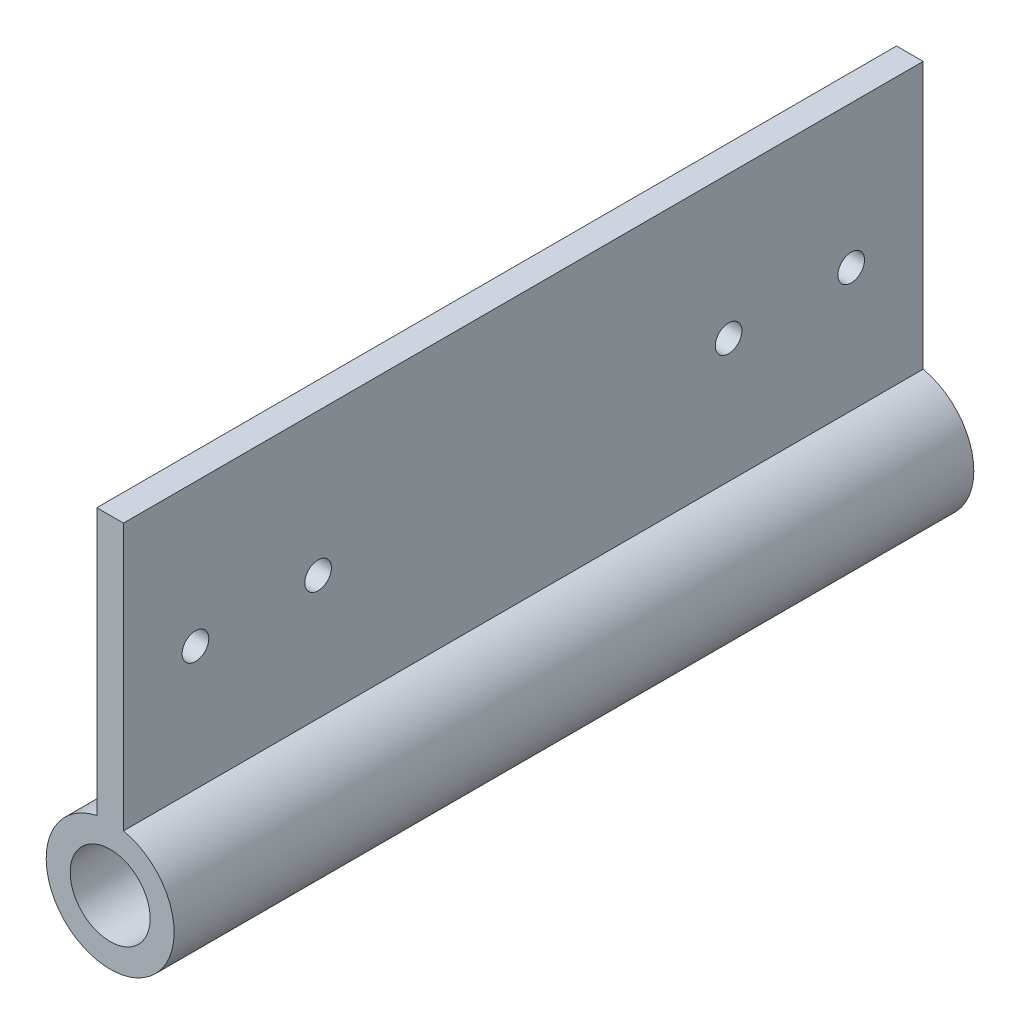
ISO-10303-21;
HEADER;
FILE_DESCRIPTION(('STEP AP214'),'2;1');
FILE_NAME('part.step','',(''),(''),'','','');
FILE_SCHEMA(('AUTOMOTIVE_DESIGN { 1 0 10303 214 1 1 1 1 }'));
ENDSEC;
DATA;
#1=APPLICATION_CONTEXT('core data for automotive mechanical design processes');
#2=APPLICATION_PROTOCOL_DEFINITION('international standard','automotive_design',2000,#1);
#3=PRODUCT_CONTEXT('',#1,'mechanical');
#4=PRODUCT('Part','Part','',(#3));
#5=PRODUCT_RELATED_PRODUCT_CATEGORY('part','',(#4));
#6=PRODUCT_DEFINITION_FORMATION('','',#4);
#7=PRODUCT_DEFINITION_CONTEXT('part definition',#1,'design');
#8=PRODUCT_DEFINITION('design','',#6,#7);
#9=PRODUCT_DEFINITION_SHAPE('','',#8);
#10=(LENGTH_UNIT() NAMED_UNIT(*) SI_UNIT(.MILLI.,.METRE.));
#11=(NAMED_UNIT(*) PLANE_ANGLE_UNIT() SI_UNIT($,.RADIAN.));
#12=(NAMED_UNIT(*) SI_UNIT($,.STERADIAN.) SOLID_ANGLE_UNIT());
#13=UNCERTAINTY_MEASURE_WITH_UNIT(LENGTH_MEASURE(1.E-05),#10,'distance_accuracy_value','');
#14=(GEOMETRIC_REPRESENTATION_CONTEXT(3) GLOBAL_UNCERTAINTY_ASSIGNED_CONTEXT((#13)) GLOBAL_UNIT_ASSIGNED_CONTEXT((#10,
#11,#12)) REPRESENTATION_CONTEXT('',''));
#15=CARTESIAN_POINT('',(0.,0.,0.));
#16=DIRECTION('',(0.,0.,1.));
#17=DIRECTION('',(1.,0.,0.));
#18=AXIS2_PLACEMENT_3D('',#15,#16,#17);
#19=CARTESIAN_POINT('',(0.,0.,150.));
#20=DIRECTION('',(0.,0.,1.));
#21=DIRECTION('',(1.,0.,0.));
#22=AXIS2_PLACEMENT_3D('',#19,#20,#21);
#23=PLANE('',#22);
#24=DIRECTION('',(-1.,0.,0.));
#25=VECTOR('',#24,1.);
#26=CARTESIAN_POINT('',(-2.50000000000001,61.7366945943055,150.));
#27=LINE('',#26,#25);
#28=CARTESIAN_POINT('',(2.49999999999999,61.7366945943055,150.));
#29=VERTEX_POINT('',#28);
#30=CARTESIAN_POINT('',(-2.50000000000001,61.7366945943055,150.));
#31=VERTEX_POINT('',#30);
#32=EDGE_CURVE('E91',#29,#31,#27,.T.);
#33=ORIENTED_EDGE('',*,*,#32,.T.);
#34=DIRECTION('',(0.,-1.,0.));
#35=VECTOR('',#34,1.);
#36=CARTESIAN_POINT('',(-2.50000000000001,61.7366945943055,150.));
#37=LINE('',#36,#35);
#38=CARTESIAN_POINT('',(-2.5,11.7366945943055,150.));
#39=VERTEX_POINT('',#38);
#40=EDGE_CURVE('E86',#31,#39,#37,.T.);
#41=ORIENTED_EDGE('',*,*,#40,.T.);
#42=CARTESIAN_POINT('',(0.,0.,150.));
#43=DIRECTION('',(0.,0.,1.));
#44=DIRECTION('',(1.,0.,0.));
#45=AXIS2_PLACEMENT_3D('',#42,#43,#44);
#46=CIRCLE('',#45,12.);
#47=CARTESIAN_POINT('',(2.5,11.7366945943055,150.));
#48=VERTEX_POINT('',#47);
#49=EDGE_CURVE('E89',#39,#48,#46,.T.);
#50=ORIENTED_EDGE('',*,*,#49,.T.);
#51=DIRECTION('',(0.,1.,0.));
#52=VECTOR('',#51,1.);
#53=CARTESIAN_POINT('',(2.49999999999999,61.7366945943055,150.));
#54=LINE('',#53,#52);
#55=EDGE_CURVE('E56',#48,#29,#54,.T.);
#56=ORIENTED_EDGE('',*,*,#55,.T.);
#57=EDGE_LOOP('',(#33,#41,#50,#56));
#58=FACE_BOUND('',#57,.T.);
#59=CARTESIAN_POINT('',(0.,0.,150.));
#60=DIRECTION('',(0.,0.,1.));
#61=DIRECTION('',(1.,0.,0.));
#62=AXIS2_PLACEMENT_3D('',#59,#60,#61);
#63=CIRCLE('',#62,7.5);
#64=CARTESIAN_POINT('',(7.5,0.,150.));
#65=VERTEX_POINT('',#64);
#66=EDGE_CURVE('E107',#65,#65,#63,.T.);
#67=ORIENTED_EDGE('',*,*,#66,.F.);
#68=EDGE_LOOP('',(#67));
#69=FACE_BOUND('',#68,.T.);
#70=ADVANCED_FACE('F37',(#58,#69),#23,.T.);
#71=CARTESIAN_POINT('',(0.,0.,0.));
#72=DIRECTION('',(0.,0.,1.));
#73=DIRECTION('',(1.,0.,0.));
#74=AXIS2_PLACEMENT_3D('',#71,#72,#73);
#75=PLANE('',#74);
#76=DIRECTION('',(-1.,0.,0.));
#77=VECTOR('',#76,1.);
#78=CARTESIAN_POINT('',(-2.50000000000001,61.7366945943055,0.));
#79=LINE('',#78,#77);
#80=CARTESIAN_POINT('',(2.49999999999999,61.7366945943055,0.));
#81=VERTEX_POINT('',#80);
#82=CARTESIAN_POINT('',(-2.50000000000001,61.7366945943055,0.));
#83=VERTEX_POINT('',#82);
#84=EDGE_CURVE('E104',#81,#83,#79,.T.);
#85=ORIENTED_EDGE('',*,*,#84,.F.);
#86=DIRECTION('',(0.,1.,0.));
#87=VECTOR('',#86,1.);
#88=CARTESIAN_POINT('',(2.49999999999999,61.7366945943055,0.));
#89=LINE('',#88,#87);
#90=CARTESIAN_POINT('',(2.5,11.7366945943055,0.));
#91=VERTEX_POINT('',#90);
#92=EDGE_CURVE('E79',#91,#81,#89,.T.);
#93=ORIENTED_EDGE('',*,*,#92,.F.);
#94=CARTESIAN_POINT('',(0.,0.,0.));
#95=DIRECTION('',(0.,0.,1.));
#96=DIRECTION('',(1.,0.,0.));
#97=AXIS2_PLACEMENT_3D('',#94,#95,#96);
#98=CIRCLE('',#97,12.);
#99=CARTESIAN_POINT('',(-2.5,11.7366945943055,0.));
#100=VERTEX_POINT('',#99);
#101=EDGE_CURVE('E73',#100,#91,#98,.T.);
#102=ORIENTED_EDGE('',*,*,#101,.F.);
#103=DIRECTION('',(0.,-1.,0.));
#104=VECTOR('',#103,1.);
#105=CARTESIAN_POINT('',(-2.50000000000001,61.7366945943055,0.));
#106=LINE('',#105,#104);
#107=EDGE_CURVE('E95',#83,#100,#106,.T.);
#108=ORIENTED_EDGE('',*,*,#107,.F.);
#109=EDGE_LOOP('',(#85,#93,#102,#108));
#110=FACE_BOUND('',#109,.T.);
#111=CARTESIAN_POINT('',(0.,0.,0.));
#112=DIRECTION('',(0.,0.,1.));
#113=DIRECTION('',(1.,0.,0.));
#114=AXIS2_PLACEMENT_3D('',#111,#112,#113);
#115=CIRCLE('',#114,7.5);
#116=CARTESIAN_POINT('',(7.5,0.,0.));
#117=VERTEX_POINT('',#116);
#118=EDGE_CURVE('E124',#117,#117,#115,.T.);
#119=ORIENTED_EDGE('',*,*,#118,.T.);
#120=EDGE_LOOP('',(#119));
#121=FACE_BOUND('',#120,.T.);
#122=ADVANCED_FACE('F173',(#110,#121),#75,.F.);
#123=CARTESIAN_POINT('',(-2.50000000000001,61.7366945943055,150.));
#124=DIRECTION('',(0.,-1.,0.));
#125=DIRECTION('',(0.,0.,-1.));
#126=AXIS2_PLACEMENT_3D('',#123,#124,#125);
#127=PLANE('',#126);
#128=ORIENTED_EDGE('',*,*,#84,.T.);
#129=DIRECTION('',(0.,0.,-1.));
#130=VECTOR('',#129,1.);
#131=CARTESIAN_POINT('',(-2.50000000000001,61.7366945943055,150.));
#132=LINE('',#131,#130);
#133=EDGE_CURVE('E11',#31,#83,#132,.T.);
#134=ORIENTED_EDGE('',*,*,#133,.F.);
#135=ORIENTED_EDGE('',*,*,#32,.F.);
#136=DIRECTION('',(0.,0.,-1.));
#137=VECTOR('',#136,1.);
#138=CARTESIAN_POINT('',(2.49999999999999,61.7366945943055,150.));
#139=LINE('',#138,#137);
#140=EDGE_CURVE('E100',#29,#81,#139,.T.);
#141=ORIENTED_EDGE('',*,*,#140,.T.);
#142=EDGE_LOOP('',(#128,#134,#135,#141));
#143=FACE_BOUND('',#142,.T.);
#144=ADVANCED_FACE('F39',(#143),#127,.F.);
#145=CARTESIAN_POINT('',(-2.50000000000001,61.7366945943055,150.));
#146=DIRECTION('',(1.,0.,0.));
#147=DIRECTION('',(0.,1.,0.));
#148=AXIS2_PLACEMENT_3D('',#145,#146,#147);
#149=PLANE('',#148);
#150=CARTESIAN_POINT('',(-2.5,35.,13.5));
#151=DIRECTION('',(-1.,0.,0.));
#152=DIRECTION('',(0.,-1.,0.));
#153=AXIS2_PLACEMENT_3D('',#150,#151,#152);
#154=CIRCLE('',#153,2.5);
#155=CARTESIAN_POINT('',(-2.5,32.5,13.5));
#156=VERTEX_POINT('',#155);
#157=EDGE_CURVE('E137',#156,#156,#154,.T.);
#158=ORIENTED_EDGE('',*,*,#157,.F.);
#159=EDGE_LOOP('',(#158));
#160=FACE_BOUND('',#159,.T.);
#161=CARTESIAN_POINT('',(-2.5,35.,36.5));
#162=DIRECTION('',(-1.,0.,0.));
#163=DIRECTION('',(0.,-1.,0.));
#164=AXIS2_PLACEMENT_3D('',#161,#162,#163);
#165=CIRCLE('',#164,2.5);
#166=CARTESIAN_POINT('',(-2.5,32.5,36.5));
#167=VERTEX_POINT('',#166);
#168=EDGE_CURVE('E140',#167,#167,#165,.T.);
#169=ORIENTED_EDGE('',*,*,#168,.F.);
#170=EDGE_LOOP('',(#169));
#171=FACE_BOUND('',#170,.T.);
#172=CARTESIAN_POINT('',(-2.5,35.,136.5));
#173=DIRECTION('',(-1.,0.,0.));
#174=DIRECTION('',(0.,-1.,0.));
#175=AXIS2_PLACEMENT_3D('',#172,#173,#174);
#176=CIRCLE('',#175,2.5);
#177=CARTESIAN_POINT('',(-2.5,32.5,136.5));
#178=VERTEX_POINT('',#177);
#179=EDGE_CURVE('E136',#178,#178,#176,.T.);
#180=ORIENTED_EDGE('',*,*,#179,.F.);
#181=EDGE_LOOP('',(#180));
#182=FACE_BOUND('',#181,.T.);
#183=CARTESIAN_POINT('',(-2.5,35.,113.5));
#184=DIRECTION('',(-1.,0.,0.));
#185=DIRECTION('',(0.,-1.,0.));
#186=AXIS2_PLACEMENT_3D('',#183,#184,#185);
#187=CIRCLE('',#186,2.50000000000001);
#188=CARTESIAN_POINT('',(-2.5,32.5,113.5));
#189=VERTEX_POINT('',#188);
#190=EDGE_CURVE('E117',#189,#189,#187,.T.);
#191=ORIENTED_EDGE('',*,*,#190,.F.);
#192=EDGE_LOOP('',(#191));
#193=FACE_BOUND('',#192,.T.);
#194=ORIENTED_EDGE('',*,*,#107,.T.);
#195=DIRECTION('',(0.,0.,-1.));
#196=VECTOR('',#195,1.);
#197=CARTESIAN_POINT('',(-2.5,11.7366945943055,150.));
#198=LINE('',#197,#196);
#199=EDGE_CURVE('E47',#39,#100,#198,.T.);
#200=ORIENTED_EDGE('',*,*,#199,.F.);
#201=ORIENTED_EDGE('',*,*,#40,.F.);
#202=ORIENTED_EDGE('',*,*,#133,.T.);
#203=EDGE_LOOP('',(#194,#200,#201,#202));
#204=FACE_BOUND('',#203,.T.);
#205=ADVANCED_FACE('F94',(#160,#171,#182,#193,#204),#149,.F.);
#206=CARTESIAN_POINT('',(0.,0.,150.));
#207=DIRECTION('',(0.,0.,-1.));
#208=DIRECTION('',(-1.,0.,0.));
#209=AXIS2_PLACEMENT_3D('',#206,#207,#208);
#210=CYLINDRICAL_SURFACE('',#209,12.);
#211=ORIENTED_EDGE('',*,*,#101,.T.);
#212=DIRECTION('',(0.,0.,-1.));
#213=VECTOR('',#212,1.);
#214=CARTESIAN_POINT('',(2.5,11.7366945943055,150.));
#215=LINE('',#214,#213);
#216=EDGE_CURVE('E96',#48,#91,#215,.T.);
#217=ORIENTED_EDGE('',*,*,#216,.F.);
#218=ORIENTED_EDGE('',*,*,#49,.F.);
#219=ORIENTED_EDGE('',*,*,#199,.T.);
#220=EDGE_LOOP('',(#211,#217,#218,#219));
#221=FACE_BOUND('',#220,.T.);
#222=ADVANCED_FACE('F98',(#221),#210,.T.);
#223=CARTESIAN_POINT('',(2.49999999999999,61.7366945943055,150.));
#224=DIRECTION('',(-1.,0.,0.));
#225=DIRECTION('',(0.,-1.,0.));
#226=AXIS2_PLACEMENT_3D('',#223,#224,#225);
#227=PLANE('',#226);
#228=CARTESIAN_POINT('',(2.5,35.,13.5));
#229=DIRECTION('',(-1.,0.,0.));
#230=DIRECTION('',(0.,-1.,0.));
#231=AXIS2_PLACEMENT_3D('',#228,#229,#230);
#232=CIRCLE('',#231,2.5);
#233=CARTESIAN_POINT('',(2.5,32.5,13.5));
#234=VERTEX_POINT('',#233);
#235=EDGE_CURVE('E41',#234,#234,#232,.T.);
#236=ORIENTED_EDGE('',*,*,#235,.T.);
#237=EDGE_LOOP('',(#236));
#238=FACE_BOUND('',#237,.T.);
#239=CARTESIAN_POINT('',(2.5,35.,36.5));
#240=DIRECTION('',(-1.,0.,0.));
#241=DIRECTION('',(0.,-1.,0.));
#242=AXIS2_PLACEMENT_3D('',#239,#240,#241);
#243=CIRCLE('',#242,2.5);
#244=CARTESIAN_POINT('',(2.5,32.5,36.5));
#245=VERTEX_POINT('',#244);
#246=EDGE_CURVE('E119',#245,#245,#243,.T.);
#247=ORIENTED_EDGE('',*,*,#246,.T.);
#248=EDGE_LOOP('',(#247));
#249=FACE_BOUND('',#248,.T.);
#250=CARTESIAN_POINT('',(2.5,35.,136.5));
#251=DIRECTION('',(-1.,0.,0.));
#252=DIRECTION('',(0.,-1.,0.));
#253=AXIS2_PLACEMENT_3D('',#250,#251,#252);
#254=CIRCLE('',#253,2.5);
#255=CARTESIAN_POINT('',(2.5,32.5,136.5));
#256=VERTEX_POINT('',#255);
#257=EDGE_CURVE('E116',#256,#256,#254,.T.);
#258=ORIENTED_EDGE('',*,*,#257,.T.);
#259=EDGE_LOOP('',(#258));
#260=FACE_BOUND('',#259,.T.);
#261=CARTESIAN_POINT('',(2.5,35.,113.5));
#262=DIRECTION('',(-1.,0.,0.));
#263=DIRECTION('',(0.,-1.,0.));
#264=AXIS2_PLACEMENT_3D('',#261,#262,#263);
#265=CIRCLE('',#264,2.50000000000001);
#266=CARTESIAN_POINT('',(2.5,32.5,113.5));
#267=VERTEX_POINT('',#266);
#268=EDGE_CURVE('E113',#267,#267,#265,.T.);
#269=ORIENTED_EDGE('',*,*,#268,.T.);
#270=EDGE_LOOP('',(#269));
#271=FACE_BOUND('',#270,.T.);
#272=ORIENTED_EDGE('',*,*,#92,.T.);
#273=ORIENTED_EDGE('',*,*,#140,.F.);
#274=ORIENTED_EDGE('',*,*,#55,.F.);
#275=ORIENTED_EDGE('',*,*,#216,.T.);
#276=EDGE_LOOP('',(#272,#273,#274,#275));
#277=FACE_BOUND('',#276,.T.);
#278=ADVANCED_FACE('F161',(#238,#249,#260,#271,#277),#227,.F.);
#279=CARTESIAN_POINT('',(0.,0.,150.));
#280=DIRECTION('',(0.,0.,-1.));
#281=DIRECTION('',(-1.,0.,0.));
#282=AXIS2_PLACEMENT_3D('',#279,#280,#281);
#283=CYLINDRICAL_SURFACE('',#282,7.5);
#284=ORIENTED_EDGE('',*,*,#66,.T.);
#285=EDGE_LOOP('',(#284));
#286=FACE_BOUND('',#285,.T.);
#287=ORIENTED_EDGE('',*,*,#118,.F.);
#288=EDGE_LOOP('',(#287));
#289=FACE_BOUND('',#288,.T.);
#290=ADVANCED_FACE('F157',(#286,#289),#283,.F.);
#291=CARTESIAN_POINT('',(12.,35.,113.5));
#292=DIRECTION('',(-1.,0.,0.));
#293=DIRECTION('',(0.,-1.,0.));
#294=AXIS2_PLACEMENT_3D('',#291,#292,#293);
#295=CYLINDRICAL_SURFACE('',#294,2.50000000000001);
#296=ORIENTED_EDGE('',*,*,#190,.T.);
#297=EDGE_LOOP('',(#296));
#298=FACE_BOUND('',#297,.T.);
#299=ORIENTED_EDGE('',*,*,#268,.F.);
#300=EDGE_LOOP('',(#299));
#301=FACE_BOUND('',#300,.T.);
#302=ADVANCED_FACE('F154',(#298,#301),#295,.F.);
#303=CARTESIAN_POINT('',(12.,35.,136.5));
#304=DIRECTION('',(-1.,0.,0.));
#305=DIRECTION('',(0.,-1.,0.));
#306=AXIS2_PLACEMENT_3D('',#303,#304,#305);
#307=CYLINDRICAL_SURFACE('',#306,2.5);
#308=ORIENTED_EDGE('',*,*,#179,.T.);
#309=EDGE_LOOP('',(#308));
#310=FACE_BOUND('',#309,.T.);
#311=ORIENTED_EDGE('',*,*,#257,.F.);
#312=EDGE_LOOP('',(#311));
#313=FACE_BOUND('',#312,.T.);
#314=ADVANCED_FACE('F146',(#310,#313),#307,.F.);
#315=CARTESIAN_POINT('',(12.,35.,36.5));
#316=DIRECTION('',(-1.,0.,0.));
#317=DIRECTION('',(0.,-1.,0.));
#318=AXIS2_PLACEMENT_3D('',#315,#316,#317);
#319=CYLINDRICAL_SURFACE('',#318,2.5);
#320=ORIENTED_EDGE('',*,*,#168,.T.);
#321=EDGE_LOOP('',(#320));
#322=FACE_BOUND('',#321,.T.);
#323=ORIENTED_EDGE('',*,*,#246,.F.);
#324=EDGE_LOOP('',(#323));
#325=FACE_BOUND('',#324,.T.);
#326=ADVANCED_FACE('F183',(#322,#325),#319,.F.);
#327=CARTESIAN_POINT('',(12.,35.,13.5));
#328=DIRECTION('',(-1.,0.,0.));
#329=DIRECTION('',(0.,-1.,0.));
#330=AXIS2_PLACEMENT_3D('',#327,#328,#329);
#331=CYLINDRICAL_SURFACE('',#330,2.5);
#332=ORIENTED_EDGE('',*,*,#157,.T.);
#333=EDGE_LOOP('',(#332));
#334=FACE_BOUND('',#333,.T.);
#335=ORIENTED_EDGE('',*,*,#235,.F.);
#336=EDGE_LOOP('',(#335));
#337=FACE_BOUND('',#336,.T.);
#338=ADVANCED_FACE('F180',(#334,#337),#331,.F.);
#339=CLOSED_SHELL('',(#70,#122,#144,#205,#222,#278,#290,#302,#314,#326,#338));
#340=MANIFOLD_SOLID_BREP('B2',#339);
#341=ADVANCED_BREP_SHAPE_REPRESENTATION('',(#18,#340),#14);
#342=SHAPE_DEFINITION_REPRESENTATION(#9,#341);
ENDSEC;
END-ISO-10303-21;
